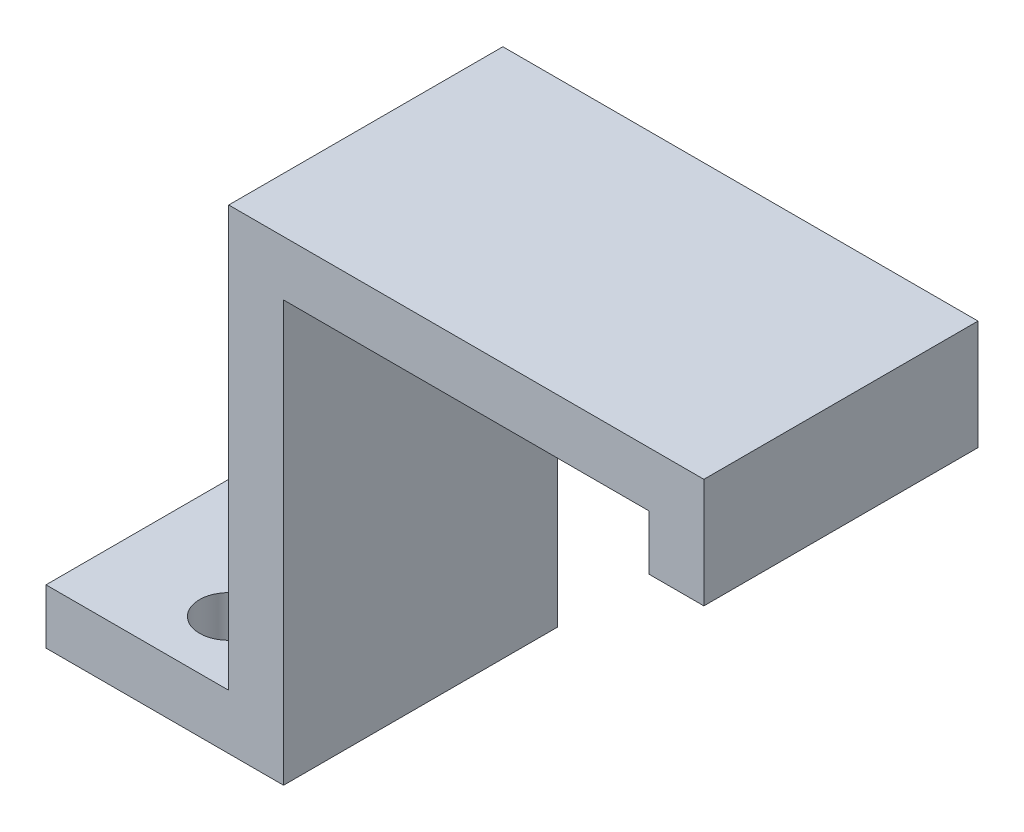
ISO-10303-21;
HEADER;
FILE_DESCRIPTION(('STEP AP214'),'2;1');
FILE_NAME('part.step','',(''),(''),'','','');
FILE_SCHEMA(('AUTOMOTIVE_DESIGN { 1 0 10303 214 1 1 1 1 }'));
ENDSEC;
DATA;
#1=APPLICATION_CONTEXT('core data for automotive mechanical design processes');
#2=APPLICATION_PROTOCOL_DEFINITION('international standard','automotive_design',2000,#1);
#3=PRODUCT_CONTEXT('',#1,'mechanical');
#4=PRODUCT('Part','Part','',(#3));
#5=PRODUCT_RELATED_PRODUCT_CATEGORY('part','',(#4));
#6=PRODUCT_DEFINITION_FORMATION('','',#4);
#7=PRODUCT_DEFINITION_CONTEXT('part definition',#1,'design');
#8=PRODUCT_DEFINITION('design','',#6,#7);
#9=PRODUCT_DEFINITION_SHAPE('','',#8);
#10=(LENGTH_UNIT() NAMED_UNIT(*) SI_UNIT(.MILLI.,.METRE.));
#11=(NAMED_UNIT(*) PLANE_ANGLE_UNIT() SI_UNIT($,.RADIAN.));
#12=(NAMED_UNIT(*) SI_UNIT($,.STERADIAN.) SOLID_ANGLE_UNIT());
#13=UNCERTAINTY_MEASURE_WITH_UNIT(LENGTH_MEASURE(1.E-05),#10,'distance_accuracy_value','');
#14=(GEOMETRIC_REPRESENTATION_CONTEXT(3) GLOBAL_UNCERTAINTY_ASSIGNED_CONTEXT((#13)) GLOBAL_UNIT_ASSIGNED_CONTEXT((#10,
#11,#12)) REPRESENTATION_CONTEXT('',''));
#15=CARTESIAN_POINT('',(0.,0.,0.));
#16=DIRECTION('',(0.,0.,1.));
#17=DIRECTION('',(1.,0.,0.));
#18=AXIS2_PLACEMENT_3D('',#15,#16,#17);
#19=CARTESIAN_POINT('',(0.,0.,15.));
#20=DIRECTION('',(1.,0.,0.));
#21=DIRECTION('',(0.,1.,0.));
#22=AXIS2_PLACEMENT_3D('',#19,#20,#21);
#23=PLANE('',#22);
#24=DIRECTION('',(0.,-1.,0.));
#25=VECTOR('',#24,1.);
#26=CARTESIAN_POINT('',(0.,0.,0.));
#27=LINE('',#26,#25);
#28=CARTESIAN_POINT('',(0.,0.,0.));
#29=VERTEX_POINT('',#28);
#30=CARTESIAN_POINT('',(0.,-23.,0.));
#31=VERTEX_POINT('',#30);
#32=EDGE_CURVE('E140',#29,#31,#27,.T.);
#33=ORIENTED_EDGE('',*,*,#32,.T.);
#34=DIRECTION('',(0.,0.,-1.));
#35=VECTOR('',#34,1.);
#36=CARTESIAN_POINT('',(0.,-23.,15.));
#37=LINE('',#36,#35);
#38=CARTESIAN_POINT('',(0.,-23.,15.));
#39=VERTEX_POINT('',#38);
#40=EDGE_CURVE('E11',#39,#31,#37,.T.);
#41=ORIENTED_EDGE('',*,*,#40,.F.);
#42=DIRECTION('',(0.,-1.,0.));
#43=VECTOR('',#42,1.);
#44=CARTESIAN_POINT('',(0.,0.,15.));
#45=LINE('',#44,#43);
#46=CARTESIAN_POINT('',(0.,0.,15.));
#47=VERTEX_POINT('',#46);
#48=EDGE_CURVE('E159',#47,#39,#45,.T.);
#49=ORIENTED_EDGE('',*,*,#48,.F.);
#50=DIRECTION('',(0.,0.,-1.));
#51=VECTOR('',#50,1.);
#52=CARTESIAN_POINT('',(0.,0.,15.));
#53=LINE('',#52,#51);
#54=EDGE_CURVE('E136',#47,#29,#53,.T.);
#55=ORIENTED_EDGE('',*,*,#54,.T.);
#56=EDGE_LOOP('',(#33,#41,#49,#55));
#57=FACE_BOUND('',#56,.T.);
#58=ADVANCED_FACE('F32',(#57),#23,.F.);
#59=CARTESIAN_POINT('',(-10.,-23.,15.));
#60=DIRECTION('',(0.,-1.,0.));
#61=DIRECTION('',(0.,0.,-1.));
#62=AXIS2_PLACEMENT_3D('',#59,#60,#61);
#63=PLANE('',#62);
#64=CARTESIAN_POINT('',(-6.5,-23.,3.5));
#65=DIRECTION('',(0.,1.,0.));
#66=DIRECTION('',(0.,0.,1.));
#67=AXIS2_PLACEMENT_3D('',#64,#65,#66);
#68=CIRCLE('',#67,1.6);
#69=CARTESIAN_POINT('',(-6.5,-23.,5.1));
#70=VERTEX_POINT('',#69);
#71=EDGE_CURVE('E212',#70,#70,#68,.T.);
#72=ORIENTED_EDGE('',*,*,#71,.F.);
#73=EDGE_LOOP('',(#72));
#74=FACE_BOUND('',#73,.T.);
#75=CARTESIAN_POINT('',(-3.5,-23.,11.5));
#76=DIRECTION('',(0.,1.,0.));
#77=DIRECTION('',(0.,0.,1.));
#78=AXIS2_PLACEMENT_3D('',#75,#76,#77);
#79=CIRCLE('',#78,1.6);
#80=CARTESIAN_POINT('',(-3.5,-23.,13.1));
#81=VERTEX_POINT('',#80);
#82=EDGE_CURVE('E209',#81,#81,#79,.T.);
#83=ORIENTED_EDGE('',*,*,#82,.F.);
#84=EDGE_LOOP('',(#83));
#85=FACE_BOUND('',#84,.T.);
#86=DIRECTION('',(-1.,0.,0.));
#87=VECTOR('',#86,1.);
#88=CARTESIAN_POINT('',(-10.,-23.,0.));
#89=LINE('',#88,#87);
#90=CARTESIAN_POINT('',(-10.,-23.,0.));
#91=VERTEX_POINT('',#90);
#92=EDGE_CURVE('E143',#31,#91,#89,.T.);
#93=ORIENTED_EDGE('',*,*,#92,.T.);
#94=DIRECTION('',(0.,0.,-1.));
#95=VECTOR('',#94,1.);
#96=CARTESIAN_POINT('',(-10.,-23.,15.));
#97=LINE('',#96,#95);
#98=CARTESIAN_POINT('',(-10.,-23.,15.));
#99=VERTEX_POINT('',#98);
#100=EDGE_CURVE('E40',#99,#91,#97,.T.);
#101=ORIENTED_EDGE('',*,*,#100,.F.);
#102=DIRECTION('',(-1.,0.,0.));
#103=VECTOR('',#102,1.);
#104=CARTESIAN_POINT('',(-10.,-23.,15.));
#105=LINE('',#104,#103);
#106=EDGE_CURVE('E97',#39,#99,#105,.T.);
#107=ORIENTED_EDGE('',*,*,#106,.F.);
#108=ORIENTED_EDGE('',*,*,#40,.T.);
#109=EDGE_LOOP('',(#93,#101,#107,#108));
#110=FACE_BOUND('',#109,.T.);
#111=ADVANCED_FACE('F227',(#74,#85,#110),#63,.F.);
#112=CARTESIAN_POINT('',(-10.,-26.,15.));
#113=DIRECTION('',(1.,0.,0.));
#114=DIRECTION('',(0.,0.,-1.));
#115=AXIS2_PLACEMENT_3D('',#112,#113,#114);
#116=PLANE('',#115);
#117=DIRECTION('',(0.,-1.,0.));
#118=VECTOR('',#117,1.);
#119=CARTESIAN_POINT('',(-10.,-26.,0.));
#120=LINE('',#119,#118);
#121=CARTESIAN_POINT('',(-10.,-26.,0.));
#122=VERTEX_POINT('',#121);
#123=EDGE_CURVE('E146',#91,#122,#120,.T.);
#124=ORIENTED_EDGE('',*,*,#123,.T.);
#125=DIRECTION('',(0.,0.,-1.));
#126=VECTOR('',#125,1.);
#127=CARTESIAN_POINT('',(-10.,-26.,15.));
#128=LINE('',#127,#126);
#129=CARTESIAN_POINT('',(-10.,-26.,15.));
#130=VERTEX_POINT('',#129);
#131=EDGE_CURVE('E172',#130,#122,#128,.T.);
#132=ORIENTED_EDGE('',*,*,#131,.F.);
#133=DIRECTION('',(0.,-1.,0.));
#134=VECTOR('',#133,1.);
#135=CARTESIAN_POINT('',(-10.,-26.,15.));
#136=LINE('',#135,#134);
#137=EDGE_CURVE('E180',#99,#130,#136,.T.);
#138=ORIENTED_EDGE('',*,*,#137,.F.);
#139=ORIENTED_EDGE('',*,*,#100,.T.);
#140=EDGE_LOOP('',(#124,#132,#138,#139));
#141=FACE_BOUND('',#140,.T.);
#142=ADVANCED_FACE('F178',(#141),#116,.F.);
#143=CARTESIAN_POINT('',(3.,-26.,15.));
#144=DIRECTION('',(0.,1.,0.));
#145=DIRECTION('',(0.,0.,1.));
#146=AXIS2_PLACEMENT_3D('',#143,#144,#145);
#147=PLANE('',#146);
#148=CARTESIAN_POINT('',(-6.5,-26.,3.5));
#149=DIRECTION('',(0.,1.,0.));
#150=DIRECTION('',(0.,0.,1.));
#151=AXIS2_PLACEMENT_3D('',#148,#149,#150);
#152=CIRCLE('',#151,1.6);
#153=CARTESIAN_POINT('',(-6.5,-26.,5.1));
#154=VERTEX_POINT('',#153);
#155=EDGE_CURVE('E144',#154,#154,#152,.T.);
#156=ORIENTED_EDGE('',*,*,#155,.T.);
#157=EDGE_LOOP('',(#156));
#158=FACE_BOUND('',#157,.T.);
#159=CARTESIAN_POINT('',(-3.5,-26.,11.5));
#160=DIRECTION('',(0.,1.,0.));
#161=DIRECTION('',(0.,0.,1.));
#162=AXIS2_PLACEMENT_3D('',#159,#160,#161);
#163=CIRCLE('',#162,1.6);
#164=CARTESIAN_POINT('',(-3.5,-26.,13.1));
#165=VERTEX_POINT('',#164);
#166=EDGE_CURVE('E206',#165,#165,#163,.T.);
#167=ORIENTED_EDGE('',*,*,#166,.T.);
#168=EDGE_LOOP('',(#167));
#169=FACE_BOUND('',#168,.T.);
#170=DIRECTION('',(1.,0.,0.));
#171=VECTOR('',#170,1.);
#172=CARTESIAN_POINT('',(3.,-26.,0.));
#173=LINE('',#172,#171);
#174=CARTESIAN_POINT('',(3.,-26.,0.));
#175=VERTEX_POINT('',#174);
#176=EDGE_CURVE('E148',#122,#175,#173,.T.);
#177=ORIENTED_EDGE('',*,*,#176,.T.);
#178=DIRECTION('',(0.,0.,-1.));
#179=VECTOR('',#178,1.);
#180=CARTESIAN_POINT('',(3.,-26.,15.));
#181=LINE('',#180,#179);
#182=CARTESIAN_POINT('',(3.,-26.,15.));
#183=VERTEX_POINT('',#182);
#184=EDGE_CURVE('E169',#183,#175,#181,.T.);
#185=ORIENTED_EDGE('',*,*,#184,.F.);
#186=DIRECTION('',(1.,0.,0.));
#187=VECTOR('',#186,1.);
#188=CARTESIAN_POINT('',(3.,-26.,15.));
#189=LINE('',#188,#187);
#190=EDGE_CURVE('E198',#130,#183,#189,.T.);
#191=ORIENTED_EDGE('',*,*,#190,.F.);
#192=ORIENTED_EDGE('',*,*,#131,.T.);
#193=EDGE_LOOP('',(#177,#185,#191,#192));
#194=FACE_BOUND('',#193,.T.);
#195=ADVANCED_FACE('F189',(#158,#169,#194),#147,.F.);
#196=CARTESIAN_POINT('',(3.,-3.,15.));
#197=DIRECTION('',(-1.,0.,0.));
#198=DIRECTION('',(0.,-1.,0.));
#199=AXIS2_PLACEMENT_3D('',#196,#197,#198);
#200=PLANE('',#199);
#201=DIRECTION('',(0.,1.,0.));
#202=VECTOR('',#201,1.);
#203=CARTESIAN_POINT('',(3.,-3.,0.));
#204=LINE('',#203,#202);
#205=CARTESIAN_POINT('',(3.,-3.,0.));
#206=VERTEX_POINT('',#205);
#207=EDGE_CURVE('E150',#175,#206,#204,.T.);
#208=ORIENTED_EDGE('',*,*,#207,.T.);
#209=DIRECTION('',(0.,0.,-1.));
#210=VECTOR('',#209,1.);
#211=CARTESIAN_POINT('',(3.,-3.,15.));
#212=LINE('',#211,#210);
#213=CARTESIAN_POINT('',(3.,-3.,15.));
#214=VERTEX_POINT('',#213);
#215=EDGE_CURVE('E166',#214,#206,#212,.T.);
#216=ORIENTED_EDGE('',*,*,#215,.F.);
#217=DIRECTION('',(0.,1.,0.));
#218=VECTOR('',#217,1.);
#219=CARTESIAN_POINT('',(3.,-3.,15.));
#220=LINE('',#219,#218);
#221=EDGE_CURVE('E195',#183,#214,#220,.T.);
#222=ORIENTED_EDGE('',*,*,#221,.F.);
#223=ORIENTED_EDGE('',*,*,#184,.T.);
#224=EDGE_LOOP('',(#208,#216,#222,#223));
#225=FACE_BOUND('',#224,.T.);
#226=ADVANCED_FACE('F193',(#225),#200,.F.);
#227=CARTESIAN_POINT('',(23.,-3.,15.));
#228=DIRECTION('',(0.,1.,0.));
#229=DIRECTION('',(-1.,0.,0.));
#230=AXIS2_PLACEMENT_3D('',#227,#228,#229);
#231=PLANE('',#230);
#232=DIRECTION('',(1.,0.,0.));
#233=VECTOR('',#232,1.);
#234=CARTESIAN_POINT('',(23.,-3.,0.));
#235=LINE('',#234,#233);
#236=CARTESIAN_POINT('',(23.,-3.,0.));
#237=VERTEX_POINT('',#236);
#238=EDGE_CURVE('E152',#206,#237,#235,.T.);
#239=ORIENTED_EDGE('',*,*,#238,.T.);
#240=DIRECTION('',(0.,0.,-1.));
#241=VECTOR('',#240,1.);
#242=CARTESIAN_POINT('',(23.,-3.,15.));
#243=LINE('',#242,#241);
#244=CARTESIAN_POINT('',(23.,-3.,15.));
#245=VERTEX_POINT('',#244);
#246=EDGE_CURVE('E163',#245,#237,#243,.T.);
#247=ORIENTED_EDGE('',*,*,#246,.F.);
#248=DIRECTION('',(1.,0.,0.));
#249=VECTOR('',#248,1.);
#250=CARTESIAN_POINT('',(23.,-3.,15.));
#251=LINE('',#250,#249);
#252=EDGE_CURVE('E197',#214,#245,#251,.T.);
#253=ORIENTED_EDGE('',*,*,#252,.F.);
#254=ORIENTED_EDGE('',*,*,#215,.T.);
#255=EDGE_LOOP('',(#239,#247,#253,#254));
#256=FACE_BOUND('',#255,.T.);
#257=ADVANCED_FACE('F239',(#256),#231,.F.);
#258=CARTESIAN_POINT('',(23.,-6.,15.));
#259=DIRECTION('',(1.,0.,0.));
#260=DIRECTION('',(0.,0.,-1.));
#261=AXIS2_PLACEMENT_3D('',#258,#259,#260);
#262=PLANE('',#261);
#263=DIRECTION('',(0.,-1.,0.));
#264=VECTOR('',#263,1.);
#265=CARTESIAN_POINT('',(23.,-6.,0.));
#266=LINE('',#265,#264);
#267=CARTESIAN_POINT('',(23.,-6.,0.));
#268=VERTEX_POINT('',#267);
#269=EDGE_CURVE('E154',#237,#268,#266,.T.);
#270=ORIENTED_EDGE('',*,*,#269,.T.);
#271=DIRECTION('',(0.,0.,-1.));
#272=VECTOR('',#271,1.);
#273=CARTESIAN_POINT('',(23.,-6.,15.));
#274=LINE('',#273,#272);
#275=CARTESIAN_POINT('',(23.,-6.,15.));
#276=VERTEX_POINT('',#275);
#277=EDGE_CURVE('E131',#276,#268,#274,.T.);
#278=ORIENTED_EDGE('',*,*,#277,.F.);
#279=DIRECTION('',(0.,-1.,0.));
#280=VECTOR('',#279,1.);
#281=CARTESIAN_POINT('',(23.,-6.,15.));
#282=LINE('',#281,#280);
#283=EDGE_CURVE('E122',#245,#276,#282,.T.);
#284=ORIENTED_EDGE('',*,*,#283,.F.);
#285=ORIENTED_EDGE('',*,*,#246,.T.);
#286=EDGE_LOOP('',(#270,#278,#284,#285));
#287=FACE_BOUND('',#286,.T.);
#288=ADVANCED_FACE('F236',(#287),#262,.F.);
#289=CARTESIAN_POINT('',(26.,-6.,15.));
#290=DIRECTION('',(0.,1.,0.));
#291=DIRECTION('',(0.,0.,1.));
#292=AXIS2_PLACEMENT_3D('',#289,#290,#291);
#293=PLANE('',#292);
#294=DIRECTION('',(1.,0.,0.));
#295=VECTOR('',#294,1.);
#296=CARTESIAN_POINT('',(26.,-6.,0.));
#297=LINE('',#296,#295);
#298=CARTESIAN_POINT('',(26.,-6.,0.));
#299=VERTEX_POINT('',#298);
#300=EDGE_CURVE('E130',#268,#299,#297,.T.);
#301=ORIENTED_EDGE('',*,*,#300,.T.);
#302=DIRECTION('',(0.,0.,-1.));
#303=VECTOR('',#302,1.);
#304=CARTESIAN_POINT('',(26.,-6.,15.));
#305=LINE('',#304,#303);
#306=CARTESIAN_POINT('',(26.,-6.,15.));
#307=VERTEX_POINT('',#306);
#308=EDGE_CURVE('E127',#307,#299,#305,.T.);
#309=ORIENTED_EDGE('',*,*,#308,.F.);
#310=DIRECTION('',(1.,0.,0.));
#311=VECTOR('',#310,1.);
#312=CARTESIAN_POINT('',(26.,-6.,15.));
#313=LINE('',#312,#311);
#314=EDGE_CURVE('E116',#276,#307,#313,.T.);
#315=ORIENTED_EDGE('',*,*,#314,.F.);
#316=ORIENTED_EDGE('',*,*,#277,.T.);
#317=EDGE_LOOP('',(#301,#309,#315,#316));
#318=FACE_BOUND('',#317,.T.);
#319=ADVANCED_FACE('F128',(#318),#293,.F.);
#320=CARTESIAN_POINT('',(26.,0.,15.));
#321=DIRECTION('',(-1.,0.,0.));
#322=DIRECTION('',(0.,0.,1.));
#323=AXIS2_PLACEMENT_3D('',#320,#321,#322);
#324=PLANE('',#323);
#325=DIRECTION('',(0.,1.,0.));
#326=VECTOR('',#325,1.);
#327=CARTESIAN_POINT('',(26.,0.,0.));
#328=LINE('',#327,#326);
#329=CARTESIAN_POINT('',(26.,0.,0.));
#330=VERTEX_POINT('',#329);
#331=EDGE_CURVE('E83',#299,#330,#328,.T.);
#332=ORIENTED_EDGE('',*,*,#331,.T.);
#333=DIRECTION('',(0.,0.,-1.));
#334=VECTOR('',#333,1.);
#335=CARTESIAN_POINT('',(26.,0.,15.));
#336=LINE('',#335,#334);
#337=CARTESIAN_POINT('',(26.,0.,15.));
#338=VERTEX_POINT('',#337);
#339=EDGE_CURVE('E132',#338,#330,#336,.T.);
#340=ORIENTED_EDGE('',*,*,#339,.F.);
#341=DIRECTION('',(0.,1.,0.));
#342=VECTOR('',#341,1.);
#343=CARTESIAN_POINT('',(26.,0.,15.));
#344=LINE('',#343,#342);
#345=EDGE_CURVE('E120',#307,#338,#344,.T.);
#346=ORIENTED_EDGE('',*,*,#345,.F.);
#347=ORIENTED_EDGE('',*,*,#308,.T.);
#348=EDGE_LOOP('',(#332,#340,#346,#347));
#349=FACE_BOUND('',#348,.T.);
#350=ADVANCED_FACE('F134',(#349),#324,.F.);
#351=CARTESIAN_POINT('',(0.,0.,15.));
#352=DIRECTION('',(0.,-1.,0.));
#353=DIRECTION('',(0.,0.,-1.));
#354=AXIS2_PLACEMENT_3D('',#351,#352,#353);
#355=PLANE('',#354);
#356=DIRECTION('',(-1.,0.,0.));
#357=VECTOR('',#356,1.);
#358=CARTESIAN_POINT('',(0.,0.,0.));
#359=LINE('',#358,#357);
#360=EDGE_CURVE('E89',#330,#29,#359,.T.);
#361=ORIENTED_EDGE('',*,*,#360,.T.);
#362=ORIENTED_EDGE('',*,*,#54,.F.);
#363=DIRECTION('',(-1.,0.,0.));
#364=VECTOR('',#363,1.);
#365=CARTESIAN_POINT('',(0.,0.,15.));
#366=LINE('',#365,#364);
#367=EDGE_CURVE('E48',#338,#47,#366,.T.);
#368=ORIENTED_EDGE('',*,*,#367,.F.);
#369=ORIENTED_EDGE('',*,*,#339,.T.);
#370=EDGE_LOOP('',(#361,#362,#368,#369));
#371=FACE_BOUND('',#370,.T.);
#372=ADVANCED_FACE('F300',(#371),#355,.F.);
#373=CARTESIAN_POINT('',(0.,0.,15.));
#374=DIRECTION('',(0.,0.,1.));
#375=DIRECTION('',(1.,0.,0.));
#376=AXIS2_PLACEMENT_3D('',#373,#374,#375);
#377=PLANE('',#376);
#378=ORIENTED_EDGE('',*,*,#48,.T.);
#379=ORIENTED_EDGE('',*,*,#106,.T.);
#380=ORIENTED_EDGE('',*,*,#137,.T.);
#381=ORIENTED_EDGE('',*,*,#190,.T.);
#382=ORIENTED_EDGE('',*,*,#221,.T.);
#383=ORIENTED_EDGE('',*,*,#252,.T.);
#384=ORIENTED_EDGE('',*,*,#283,.T.);
#385=ORIENTED_EDGE('',*,*,#314,.T.);
#386=ORIENTED_EDGE('',*,*,#345,.T.);
#387=ORIENTED_EDGE('',*,*,#367,.T.);
#388=EDGE_LOOP('',(#378,#379,#380,#381,#382,#383,#384,#385,#386,#387));
#389=FACE_BOUND('',#388,.T.);
#390=ADVANCED_FACE('F118',(#389),#377,.T.);
#391=CARTESIAN_POINT('',(0.,0.,0.));
#392=DIRECTION('',(0.,0.,1.));
#393=DIRECTION('',(1.,0.,0.));
#394=AXIS2_PLACEMENT_3D('',#391,#392,#393);
#395=PLANE('',#394);
#396=ORIENTED_EDGE('',*,*,#32,.F.);
#397=ORIENTED_EDGE('',*,*,#360,.F.);
#398=ORIENTED_EDGE('',*,*,#331,.F.);
#399=ORIENTED_EDGE('',*,*,#300,.F.);
#400=ORIENTED_EDGE('',*,*,#269,.F.);
#401=ORIENTED_EDGE('',*,*,#238,.F.);
#402=ORIENTED_EDGE('',*,*,#207,.F.);
#403=ORIENTED_EDGE('',*,*,#176,.F.);
#404=ORIENTED_EDGE('',*,*,#123,.F.);
#405=ORIENTED_EDGE('',*,*,#92,.F.);
#406=EDGE_LOOP('',(#396,#397,#398,#399,#400,#401,#402,#403,#404,#405));
#407=FACE_BOUND('',#406,.T.);
#408=ADVANCED_FACE('F184',(#407),#395,.F.);
#409=CARTESIAN_POINT('',(-3.5,-26.,11.5));
#410=DIRECTION('',(0.,1.,0.));
#411=DIRECTION('',(0.,0.,1.));
#412=AXIS2_PLACEMENT_3D('',#409,#410,#411);
#413=CYLINDRICAL_SURFACE('',#412,1.6);
#414=ORIENTED_EDGE('',*,*,#166,.F.);
#415=EDGE_LOOP('',(#414));
#416=FACE_BOUND('',#415,.T.);
#417=ORIENTED_EDGE('',*,*,#82,.T.);
#418=EDGE_LOOP('',(#417));
#419=FACE_BOUND('',#418,.T.);
#420=ADVANCED_FACE('F223',(#416,#419),#413,.F.);
#421=CARTESIAN_POINT('',(-6.5,-26.,3.5));
#422=DIRECTION('',(0.,1.,0.));
#423=DIRECTION('',(0.,0.,1.));
#424=AXIS2_PLACEMENT_3D('',#421,#422,#423);
#425=CYLINDRICAL_SURFACE('',#424,1.6);
#426=ORIENTED_EDGE('',*,*,#155,.F.);
#427=EDGE_LOOP('',(#426));
#428=FACE_BOUND('',#427,.T.);
#429=ORIENTED_EDGE('',*,*,#71,.T.);
#430=EDGE_LOOP('',(#429));
#431=FACE_BOUND('',#430,.T.);
#432=ADVANCED_FACE('F220',(#428,#431),#425,.F.);
#433=CLOSED_SHELL('',(#58,#111,#142,#195,#226,#257,#288,#319,#350,#372,#390,#408,#420,#432));
#434=MANIFOLD_SOLID_BREP('B2',#433);
#435=ADVANCED_BREP_SHAPE_REPRESENTATION('',(#18,#434),#14);
#436=SHAPE_DEFINITION_REPRESENTATION(#9,#435);
ENDSEC;
END-ISO-10303-21;
